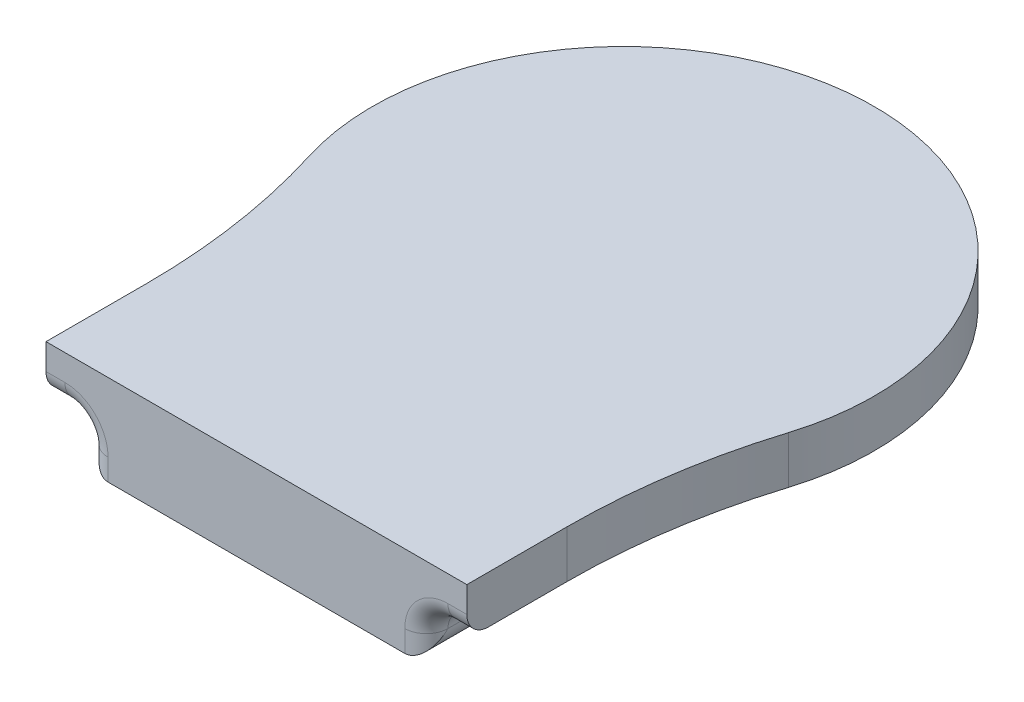
ISO-10303-21;
HEADER;
FILE_DESCRIPTION(('STEP AP214'),'2;1');
FILE_NAME('part.step','',(''),(''),'','','');
FILE_SCHEMA(('AUTOMOTIVE_DESIGN { 1 0 10303 214 1 1 1 1 }'));
ENDSEC;
DATA;
#1=APPLICATION_CONTEXT('core data for automotive mechanical design processes');
#2=APPLICATION_PROTOCOL_DEFINITION('international standard','automotive_design',2000,#1);
#3=PRODUCT_CONTEXT('',#1,'mechanical');
#4=PRODUCT('Part','Part','',(#3));
#5=PRODUCT_RELATED_PRODUCT_CATEGORY('part','',(#4));
#6=PRODUCT_DEFINITION_FORMATION('','',#4);
#7=PRODUCT_DEFINITION_CONTEXT('part definition',#1,'design');
#8=PRODUCT_DEFINITION('design','',#6,#7);
#9=PRODUCT_DEFINITION_SHAPE('','',#8);
#10=(LENGTH_UNIT() NAMED_UNIT(*) SI_UNIT(.MILLI.,.METRE.));
#11=(NAMED_UNIT(*) PLANE_ANGLE_UNIT() SI_UNIT($,.RADIAN.));
#12=(NAMED_UNIT(*) SI_UNIT($,.STERADIAN.) SOLID_ANGLE_UNIT());
#13=UNCERTAINTY_MEASURE_WITH_UNIT(LENGTH_MEASURE(1.E-05),#10,'distance_accuracy_value','');
#14=(GEOMETRIC_REPRESENTATION_CONTEXT(3) GLOBAL_UNCERTAINTY_ASSIGNED_CONTEXT((#13)) GLOBAL_UNIT_ASSIGNED_CONTEXT((#10,
#11,#12)) REPRESENTATION_CONTEXT('',''));
#15=CARTESIAN_POINT('',(0.,0.,0.));
#16=DIRECTION('',(0.,0.,1.));
#17=DIRECTION('',(1.,0.,0.));
#18=AXIS2_PLACEMENT_3D('',#15,#16,#17);
#19=CARTESIAN_POINT('',(39.75,11.3,12.3522518190004));
#20=DIRECTION('',(0.,1.,0.));
#21=DIRECTION('',(0.,0.,1.));
#22=AXIS2_PLACEMENT_3D('',#19,#20,#21);
#23=PLANE('',#22);
#24=DIRECTION('',(0.,0.,1.));
#25=VECTOR('',#24,1.);
#26=CARTESIAN_POINT('',(9.75,11.3,12.3522518190004));
#27=LINE('',#26,#25);
#28=CARTESIAN_POINT('',(9.75,11.3,12.3522518190004));
#29=VERTEX_POINT('',#28);
#30=CARTESIAN_POINT('',(9.75,11.3,16.));
#31=VERTEX_POINT('',#30);
#32=EDGE_CURVE('E276',#29,#31,#27,.T.);
#33=ORIENTED_EDGE('',*,*,#32,.T.);
#34=DIRECTION('',(-1.,0.,0.));
#35=VECTOR('',#34,1.);
#36=CARTESIAN_POINT('',(39.75,11.3,16.));
#37=LINE('',#36,#35);
#38=CARTESIAN_POINT('',(8.875,11.3,16.));
#39=VERTEX_POINT('',#38);
#40=EDGE_CURVE('E326',#31,#39,#37,.T.);
#41=ORIENTED_EDGE('',*,*,#40,.T.);
#42=DIRECTION('',(0.,0.,1.));
#43=VECTOR('',#42,1.);
#44=CARTESIAN_POINT('',(8.875,11.3,9.));
#45=LINE('',#44,#43);
#46=CARTESIAN_POINT('',(8.875,11.3,10.));
#47=VERTEX_POINT('',#46);
#48=EDGE_CURVE('E322',#39,#47,#45,.F.);
#49=ORIENTED_EDGE('',*,*,#48,.T.);
#50=CARTESIAN_POINT('',(6.875,11.3,10.));
#51=DIRECTION('',(0.,1.,0.));
#52=DIRECTION('',(0.,0.,1.));
#53=AXIS2_PLACEMENT_3D('',#50,#51,#52);
#54=CIRCLE('',#53,2.);
#55=CARTESIAN_POINT('',(6.875,11.3,8.));
#56=VERTEX_POINT('',#55);
#57=EDGE_CURVE('E319',#56,#47,#54,.F.);
#58=ORIENTED_EDGE('',*,*,#57,.F.);
#59=DIRECTION('',(1.,0.,0.));
#60=VECTOR('',#59,1.);
#61=CARTESIAN_POINT('',(-7.875,11.3,8.));
#62=LINE('',#61,#60);
#63=CARTESIAN_POINT('',(-6.875,11.3,8.));
#64=VERTEX_POINT('',#63);
#65=EDGE_CURVE('E315',#56,#64,#62,.F.);
#66=ORIENTED_EDGE('',*,*,#65,.T.);
#67=CARTESIAN_POINT('',(-6.875,11.3,10.));
#68=DIRECTION('',(0.,1.,0.));
#69=DIRECTION('',(0.,0.,1.));
#70=AXIS2_PLACEMENT_3D('',#67,#68,#69);
#71=CIRCLE('',#70,2.);
#72=CARTESIAN_POINT('',(-8.875,11.3,10.));
#73=VERTEX_POINT('',#72);
#74=EDGE_CURVE('E312',#73,#64,#71,.F.);
#75=ORIENTED_EDGE('',*,*,#74,.F.);
#76=DIRECTION('',(0.,0.,-1.));
#77=VECTOR('',#76,1.);
#78=CARTESIAN_POINT('',(-8.875,11.3,17.));
#79=LINE('',#78,#77);
#80=CARTESIAN_POINT('',(-8.875,11.3,16.));
#81=VERTEX_POINT('',#80);
#82=EDGE_CURVE('E317',#73,#81,#79,.F.);
#83=ORIENTED_EDGE('',*,*,#82,.T.);
#84=DIRECTION('',(-1.,0.,0.));
#85=VECTOR('',#84,1.);
#86=CARTESIAN_POINT('',(39.75,11.3,16.));
#87=LINE('',#86,#85);
#88=CARTESIAN_POINT('',(-9.75,11.3,16.));
#89=VERTEX_POINT('',#88);
#90=EDGE_CURVE('E324',#81,#89,#87,.T.);
#91=ORIENTED_EDGE('',*,*,#90,.T.);
#92=DIRECTION('',(0.,0.,-1.));
#93=VECTOR('',#92,1.);
#94=CARTESIAN_POINT('',(-9.75,11.3,12.3522518190004));
#95=LINE('',#94,#93);
#96=CARTESIAN_POINT('',(-9.75,11.3,12.3522518190004));
#97=VERTEX_POINT('',#96);
#98=EDGE_CURVE('E274',#89,#97,#95,.T.);
#99=ORIENTED_EDGE('',*,*,#98,.T.);
#100=CARTESIAN_POINT('',(-39.75,11.3,12.3522518190004));
#101=DIRECTION('',(0.,1.,0.));
#102=DIRECTION('',(0.,0.,1.));
#103=AXIS2_PLACEMENT_3D('',#100,#101,#102);
#104=CIRCLE('',#103,30.);
#105=CARTESIAN_POINT('',(-11.1013513513514,11.3,3.44972798548661));
#106=VERTEX_POINT('',#105);
#107=EDGE_CURVE('E271',#97,#106,#104,.T.);
#108=ORIENTED_EDGE('',*,*,#107,.T.);
#109=CARTESIAN_POINT('',(0.,11.3,0.));
#110=DIRECTION('',(0.,1.,0.));
#111=DIRECTION('',(0.,0.,1.));
#112=AXIS2_PLACEMENT_3D('',#109,#110,#111);
#113=CIRCLE('',#112,11.625);
#114=CARTESIAN_POINT('',(11.1013513513513,11.3,3.44972798548662));
#115=VERTEX_POINT('',#114);
#116=EDGE_CURVE('E267',#106,#115,#113,.F.);
#117=ORIENTED_EDGE('',*,*,#116,.T.);
#118=CARTESIAN_POINT('',(39.75,11.3,12.3522518190004));
#119=DIRECTION('',(0.,1.,0.));
#120=DIRECTION('',(0.,0.,1.));
#121=AXIS2_PLACEMENT_3D('',#118,#119,#120);
#122=CIRCLE('',#121,30.);
#123=EDGE_CURVE('E106',#115,#29,#122,.T.);
#124=ORIENTED_EDGE('',*,*,#123,.T.);
#125=EDGE_LOOP('',(#33,#41,#49,#58,#66,#75,#83,#91,#99,#108,#117,#124));
#126=FACE_BOUND('',#125,.T.);
#127=ADVANCED_FACE('F49',(#126),#23,.F.);
#128=CARTESIAN_POINT('',(9.75,11.3,0.));
#129=DIRECTION('',(1.,0.,0.));
#130=DIRECTION('',(0.,0.,-1.));
#131=AXIS2_PLACEMENT_3D('',#128,#129,#130);
#132=PLANE('',#131);
#133=DIRECTION('',(0.,-1.,0.));
#134=VECTOR('',#133,1.);
#135=CARTESIAN_POINT('',(9.75,11.3,17.));
#136=LINE('',#135,#134);
#137=CARTESIAN_POINT('',(9.75,13.5,17.));
#138=VERTEX_POINT('',#137);
#139=CARTESIAN_POINT('',(9.75,12.3,17.));
#140=VERTEX_POINT('',#139);
#141=EDGE_CURVE('E299',#138,#140,#136,.T.);
#142=ORIENTED_EDGE('',*,*,#141,.T.);
#143=CARTESIAN_POINT('',(9.75,12.3,16.));
#144=DIRECTION('',(1.,0.,0.));
#145=DIRECTION('',(0.,0.,-1.));
#146=AXIS2_PLACEMENT_3D('',#143,#144,#145);
#147=CIRCLE('',#146,1.);
#148=EDGE_CURVE('E213',#140,#31,#147,.T.);
#149=ORIENTED_EDGE('',*,*,#148,.T.);
#150=ORIENTED_EDGE('',*,*,#32,.F.);
#151=DIRECTION('',(0.,-1.,0.));
#152=VECTOR('',#151,1.);
#153=CARTESIAN_POINT('',(9.75,11.3,12.3522518190004));
#154=LINE('',#153,#152);
#155=CARTESIAN_POINT('',(9.75,13.5,12.3522518190004));
#156=VERTEX_POINT('',#155);
#157=EDGE_CURVE('E307',#29,#156,#154,.F.);
#158=ORIENTED_EDGE('',*,*,#157,.T.);
#159=DIRECTION('',(0.,0.,-1.));
#160=VECTOR('',#159,1.);
#161=CARTESIAN_POINT('',(9.75,13.5,12.3522518190004));
#162=LINE('',#161,#160);
#163=EDGE_CURVE('E293',#138,#156,#162,.T.);
#164=ORIENTED_EDGE('',*,*,#163,.F.);
#165=EDGE_LOOP('',(#142,#149,#150,#158,#164));
#166=FACE_BOUND('',#165,.T.);
#167=ADVANCED_FACE('F350',(#166),#132,.T.);
#168=CARTESIAN_POINT('',(0.,11.3,0.));
#169=DIRECTION('',(0.,-1.,0.));
#170=DIRECTION('',(0.,0.,-1.));
#171=AXIS2_PLACEMENT_3D('',#168,#169,#170);
#172=CYLINDRICAL_SURFACE('',#171,11.625);
#173=DIRECTION('',(0.,-1.,0.));
#174=VECTOR('',#173,1.);
#175=CARTESIAN_POINT('',(11.1013513513514,11.3,3.44972798548661));
#176=LINE('',#175,#174);
#177=CARTESIAN_POINT('',(11.1013513513514,13.5,3.44972798548661));
#178=VERTEX_POINT('',#177);
#179=EDGE_CURVE('E304',#178,#115,#176,.T.);
#180=ORIENTED_EDGE('',*,*,#179,.T.);
#181=ORIENTED_EDGE('',*,*,#116,.F.);
#182=DIRECTION('',(0.,-1.,0.));
#183=VECTOR('',#182,1.);
#184=CARTESIAN_POINT('',(-11.1013513513514,11.3,3.44972798548661));
#185=LINE('',#184,#183);
#186=CARTESIAN_POINT('',(-11.1013513513513,13.5,3.44972798548661));
#187=VERTEX_POINT('',#186);
#188=EDGE_CURVE('E302',#106,#187,#185,.F.);
#189=ORIENTED_EDGE('',*,*,#188,.T.);
#190=CARTESIAN_POINT('',(0.,13.5,0.));
#191=DIRECTION('',(0.,1.,0.));
#192=DIRECTION('',(0.,0.,1.));
#193=AXIS2_PLACEMENT_3D('',#190,#191,#192);
#194=CIRCLE('',#193,11.625);
#195=EDGE_CURVE('E281',#178,#187,#194,.T.);
#196=ORIENTED_EDGE('',*,*,#195,.F.);
#197=EDGE_LOOP('',(#180,#181,#189,#196));
#198=FACE_BOUND('',#197,.T.);
#199=ADVANCED_FACE('F356',(#198),#172,.T.);
#200=CARTESIAN_POINT('',(-9.75,11.3,0.));
#201=DIRECTION('',(1.,0.,0.));
#202=DIRECTION('',(0.,0.,-1.));
#203=AXIS2_PLACEMENT_3D('',#200,#201,#202);
#204=PLANE('',#203);
#205=ORIENTED_EDGE('',*,*,#98,.F.);
#206=CARTESIAN_POINT('',(-9.75,12.3,16.));
#207=DIRECTION('',(1.,0.,0.));
#208=DIRECTION('',(0.,0.,-1.));
#209=AXIS2_PLACEMENT_3D('',#206,#207,#208);
#210=CIRCLE('',#209,1.);
#211=CARTESIAN_POINT('',(-9.75,12.3,17.));
#212=VERTEX_POINT('',#211);
#213=EDGE_CURVE('E215',#89,#212,#210,.F.);
#214=ORIENTED_EDGE('',*,*,#213,.T.);
#215=DIRECTION('',(0.,-1.,0.));
#216=VECTOR('',#215,1.);
#217=CARTESIAN_POINT('',(-9.75,11.3,17.));
#218=LINE('',#217,#216);
#219=CARTESIAN_POINT('',(-9.75,13.5,17.));
#220=VERTEX_POINT('',#219);
#221=EDGE_CURVE('E296',#220,#212,#218,.T.);
#222=ORIENTED_EDGE('',*,*,#221,.F.);
#223=DIRECTION('',(0.,0.,1.));
#224=VECTOR('',#223,1.);
#225=CARTESIAN_POINT('',(-9.75,13.5,12.3522518190004));
#226=LINE('',#225,#224);
#227=CARTESIAN_POINT('',(-9.75,13.5,12.3522518190004));
#228=VERTEX_POINT('',#227);
#229=EDGE_CURVE('E287',#228,#220,#226,.T.);
#230=ORIENTED_EDGE('',*,*,#229,.F.);
#231=DIRECTION('',(0.,1.,0.));
#232=VECTOR('',#231,1.);
#233=CARTESIAN_POINT('',(-9.75,0.,12.3522518190004));
#234=LINE('',#233,#232);
#235=EDGE_CURVE('E309',#228,#97,#234,.F.);
#236=ORIENTED_EDGE('',*,*,#235,.T.);
#237=EDGE_LOOP('',(#205,#214,#222,#230,#236));
#238=FACE_BOUND('',#237,.T.);
#239=ADVANCED_FACE('F362',(#238),#204,.F.);
#240=CARTESIAN_POINT('',(0.,11.3,17.));
#241=DIRECTION('',(0.,0.,-1.));
#242=DIRECTION('',(-1.,0.,0.));
#243=AXIS2_PLACEMENT_3D('',#240,#241,#242);
#244=PLANE('',#243);
#245=CARTESIAN_POINT('',(8.875,10.3,17.));
#246=DIRECTION('',(0.,0.,-1.));
#247=DIRECTION('',(-1.,0.,0.));
#248=AXIS2_PLACEMENT_3D('',#245,#246,#247);
#249=CIRCLE('',#248,2.);
#250=CARTESIAN_POINT('',(8.875,12.3,17.));
#251=VERTEX_POINT('',#250);
#252=CARTESIAN_POINT('',(6.875,10.3,17.));
#253=VERTEX_POINT('',#252);
#254=EDGE_CURVE('E185',#251,#253,#249,.F.);
#255=ORIENTED_EDGE('',*,*,#254,.F.);
#256=DIRECTION('',(-1.,0.,0.));
#257=VECTOR('',#256,1.);
#258=CARTESIAN_POINT('',(0.,12.3,17.));
#259=LINE('',#258,#257);
#260=EDGE_CURVE('E192',#251,#140,#259,.F.);
#261=ORIENTED_EDGE('',*,*,#260,.T.);
#262=ORIENTED_EDGE('',*,*,#141,.F.);
#263=DIRECTION('',(1.,0.,0.));
#264=VECTOR('',#263,1.);
#265=CARTESIAN_POINT('',(-9.75,13.5,17.));
#266=LINE('',#265,#264);
#267=EDGE_CURVE('E290',#220,#138,#266,.T.);
#268=ORIENTED_EDGE('',*,*,#267,.F.);
#269=ORIENTED_EDGE('',*,*,#221,.T.);
#270=DIRECTION('',(-1.,0.,0.));
#271=VECTOR('',#270,1.);
#272=CARTESIAN_POINT('',(0.,12.3,17.));
#273=LINE('',#272,#271);
#274=CARTESIAN_POINT('',(-8.875,12.3,17.));
#275=VERTEX_POINT('',#274);
#276=EDGE_CURVE('E206',#212,#275,#273,.F.);
#277=ORIENTED_EDGE('',*,*,#276,.T.);
#278=CARTESIAN_POINT('',(-8.875,10.3,17.));
#279=DIRECTION('',(0.,0.,-1.));
#280=DIRECTION('',(-1.,0.,0.));
#281=AXIS2_PLACEMENT_3D('',#278,#279,#280);
#282=CIRCLE('',#281,2.);
#283=CARTESIAN_POINT('',(-6.875,10.3,17.));
#284=VERTEX_POINT('',#283);
#285=EDGE_CURVE('E208',#284,#275,#282,.F.);
#286=ORIENTED_EDGE('',*,*,#285,.F.);
#287=DIRECTION('',(0.,1.,0.));
#288=VECTOR('',#287,1.);
#289=CARTESIAN_POINT('',(-6.875,11.3,17.));
#290=LINE('',#289,#288);
#291=CARTESIAN_POINT('',(-6.875,9.3,17.));
#292=VERTEX_POINT('',#291);
#293=EDGE_CURVE('E329',#284,#292,#290,.F.);
#294=ORIENTED_EDGE('',*,*,#293,.T.);
#295=DIRECTION('',(-1.,0.,0.));
#296=VECTOR('',#295,1.);
#297=CARTESIAN_POINT('',(7.875,9.3,17.));
#298=LINE('',#297,#296);
#299=CARTESIAN_POINT('',(6.875,9.3,17.));
#300=VERTEX_POINT('',#299);
#301=EDGE_CURVE('E188',#300,#292,#298,.T.);
#302=ORIENTED_EDGE('',*,*,#301,.F.);
#303=DIRECTION('',(0.,1.,0.));
#304=VECTOR('',#303,1.);
#305=CARTESIAN_POINT('',(6.875,11.3,17.));
#306=LINE('',#305,#304);
#307=EDGE_CURVE('E181',#300,#253,#306,.T.);
#308=ORIENTED_EDGE('',*,*,#307,.T.);
#309=EDGE_LOOP('',(#255,#261,#262,#268,#269,#277,#286,#294,#302,#308));
#310=FACE_BOUND('',#309,.T.);
#311=ADVANCED_FACE('F183',(#310),#244,.F.);
#312=CARTESIAN_POINT('',(39.75,11.3,12.3522518190004));
#313=DIRECTION('',(0.,-1.,0.));
#314=DIRECTION('',(0.,0.,-1.));
#315=AXIS2_PLACEMENT_3D('',#312,#313,#314);
#316=CYLINDRICAL_SURFACE('',#315,30.);
#317=ORIENTED_EDGE('',*,*,#157,.F.);
#318=ORIENTED_EDGE('',*,*,#123,.F.);
#319=ORIENTED_EDGE('',*,*,#179,.F.);
#320=CARTESIAN_POINT('',(39.75,13.5,12.3522518190004));
#321=DIRECTION('',(0.,-1.,0.));
#322=DIRECTION('',(0.,0.,1.));
#323=AXIS2_PLACEMENT_3D('',#320,#321,#322);
#324=CIRCLE('',#323,30.);
#325=EDGE_CURVE('E273',#156,#178,#324,.T.);
#326=ORIENTED_EDGE('',*,*,#325,.F.);
#327=EDGE_LOOP('',(#317,#318,#319,#326));
#328=FACE_BOUND('',#327,.T.);
#329=ADVANCED_FACE('F361',(#328),#316,.F.);
#330=CARTESIAN_POINT('',(-39.75,11.3,12.3522518190004));
#331=DIRECTION('',(0.,-1.,0.));
#332=DIRECTION('',(0.,0.,-1.));
#333=AXIS2_PLACEMENT_3D('',#330,#331,#332);
#334=CYLINDRICAL_SURFACE('',#333,30.);
#335=ORIENTED_EDGE('',*,*,#188,.F.);
#336=ORIENTED_EDGE('',*,*,#107,.F.);
#337=ORIENTED_EDGE('',*,*,#235,.F.);
#338=CARTESIAN_POINT('',(-39.75,13.5,12.3522518190004));
#339=DIRECTION('',(0.,-1.,0.));
#340=DIRECTION('',(0.,0.,1.));
#341=AXIS2_PLACEMENT_3D('',#338,#339,#340);
#342=CIRCLE('',#341,30.);
#343=EDGE_CURVE('E284',#187,#228,#342,.T.);
#344=ORIENTED_EDGE('',*,*,#343,.F.);
#345=EDGE_LOOP('',(#335,#336,#337,#344));
#346=FACE_BOUND('',#345,.T.);
#347=ADVANCED_FACE('F346',(#346),#334,.F.);
#348=CARTESIAN_POINT('',(39.75,13.5,12.3522518190004));
#349=DIRECTION('',(0.,1.,0.));
#350=DIRECTION('',(0.,0.,1.));
#351=AXIS2_PLACEMENT_3D('',#348,#349,#350);
#352=PLANE('',#351);
#353=ORIENTED_EDGE('',*,*,#325,.T.);
#354=ORIENTED_EDGE('',*,*,#195,.T.);
#355=ORIENTED_EDGE('',*,*,#343,.T.);
#356=ORIENTED_EDGE('',*,*,#229,.T.);
#357=ORIENTED_EDGE('',*,*,#267,.T.);
#358=ORIENTED_EDGE('',*,*,#163,.T.);
#359=EDGE_LOOP('',(#353,#354,#355,#356,#357,#358));
#360=FACE_BOUND('',#359,.T.);
#361=ADVANCED_FACE('F338',(#360),#352,.T.);
#362=CARTESIAN_POINT('',(0.,9.3,0.));
#363=DIRECTION('',(0.,1.,0.));
#364=DIRECTION('',(0.,0.,1.));
#365=AXIS2_PLACEMENT_3D('',#362,#363,#364);
#366=PLANE('',#365);
#367=DIRECTION('',(1.,0.,0.));
#368=VECTOR('',#367,1.);
#369=CARTESIAN_POINT('',(0.,9.3,10.));
#370=LINE('',#369,#368);
#371=CARTESIAN_POINT('',(-6.875,9.3,10.));
#372=VERTEX_POINT('',#371);
#373=CARTESIAN_POINT('',(6.875,9.3,10.));
#374=VERTEX_POINT('',#373);
#375=EDGE_CURVE('E67',#372,#374,#370,.T.);
#376=ORIENTED_EDGE('',*,*,#375,.T.);
#377=DIRECTION('',(0.,0.,1.));
#378=VECTOR('',#377,1.);
#379=CARTESIAN_POINT('',(6.875,9.3,0.));
#380=LINE('',#379,#378);
#381=EDGE_CURVE('E13',#374,#300,#380,.T.);
#382=ORIENTED_EDGE('',*,*,#381,.T.);
#383=ORIENTED_EDGE('',*,*,#301,.T.);
#384=DIRECTION('',(0.,0.,-1.));
#385=VECTOR('',#384,1.);
#386=CARTESIAN_POINT('',(-6.875,9.3,0.));
#387=LINE('',#386,#385);
#388=EDGE_CURVE('E59',#292,#372,#387,.T.);
#389=ORIENTED_EDGE('',*,*,#388,.T.);
#390=EDGE_LOOP('',(#376,#382,#383,#389));
#391=FACE_BOUND('',#390,.T.);
#392=ADVANCED_FACE('F336',(#391),#366,.F.);
#393=CARTESIAN_POINT('',(39.75,12.3,16.));
#394=DIRECTION('',(-1.,0.,0.));
#395=DIRECTION('',(0.,0.,1.));
#396=AXIS2_PLACEMENT_3D('',#393,#394,#395);
#397=CYLINDRICAL_SURFACE('',#396,1.);
#398=ORIENTED_EDGE('',*,*,#213,.F.);
#399=ORIENTED_EDGE('',*,*,#90,.F.);
#400=CARTESIAN_POINT('',(-8.875,12.3,16.));
#401=DIRECTION('',(1.,0.,0.));
#402=DIRECTION('',(0.,0.,-1.));
#403=AXIS2_PLACEMENT_3D('',#400,#401,#402);
#404=CIRCLE('',#403,1.);
#405=EDGE_CURVE('E53',#275,#81,#404,.T.);
#406=ORIENTED_EDGE('',*,*,#405,.F.);
#407=ORIENTED_EDGE('',*,*,#276,.F.);
#408=EDGE_LOOP('',(#398,#399,#406,#407));
#409=FACE_BOUND('',#408,.T.);
#410=ADVANCED_FACE('F51',(#409),#397,.T.);
#411=CARTESIAN_POINT('',(-6.875,9.3,16.));
#412=DIRECTION('',(0.,1.,0.));
#413=DIRECTION('',(0.,0.,1.));
#414=AXIS2_PLACEMENT_3D('',#411,#412,#413);
#415=CYLINDRICAL_SURFACE('',#414,1.);
#416=CARTESIAN_POINT('',(-6.875,10.3,16.));
#417=DIRECTION('',(0.,-0.707106781186547,-0.707106781186547));
#418=DIRECTION('',(0.,0.707106781186547,-0.707106781186547));
#419=AXIS2_PLACEMENT_3D('',#416,#417,#418);
#420=ELLIPSE('',#419,1.41421356237309,1.);
#421=CARTESIAN_POINT('',(-7.875,10.3,16.));
#422=VERTEX_POINT('',#421);
#423=EDGE_CURVE('E261',#292,#422,#420,.T.);
#424=ORIENTED_EDGE('',*,*,#423,.F.);
#425=ORIENTED_EDGE('',*,*,#293,.F.);
#426=CARTESIAN_POINT('',(-6.875,10.3,16.));
#427=DIRECTION('',(0.,1.,0.));
#428=DIRECTION('',(0.,0.,1.));
#429=AXIS2_PLACEMENT_3D('',#426,#427,#428);
#430=CIRCLE('',#429,1.);
#431=EDGE_CURVE('E98',#422,#284,#430,.T.);
#432=ORIENTED_EDGE('',*,*,#431,.F.);
#433=EDGE_LOOP('',(#424,#425,#432));
#434=FACE_BOUND('',#433,.T.);
#435=ADVANCED_FACE('F332',(#434),#415,.T.);
#436=CARTESIAN_POINT('',(-8.875,10.3,16.));
#437=DIRECTION('',(0.,0.,-1.));
#438=DIRECTION('',(-1.,0.,0.));
#439=AXIS2_PLACEMENT_3D('',#436,#437,#438);
#440=TOROIDAL_SURFACE('',#439,2.,1.);
#441=ORIENTED_EDGE('',*,*,#285,.T.);
#442=ORIENTED_EDGE('',*,*,#405,.T.);
#443=CARTESIAN_POINT('',(-8.875,10.3,16.));
#444=DIRECTION('',(0.,0.,-1.));
#445=DIRECTION('',(-1.,0.,0.));
#446=AXIS2_PLACEMENT_3D('',#443,#444,#445);
#447=CIRCLE('',#446,1.);
#448=EDGE_CURVE('E258',#422,#81,#447,.F.);
#449=ORIENTED_EDGE('',*,*,#448,.F.);
#450=ORIENTED_EDGE('',*,*,#431,.T.);
#451=EDGE_LOOP('',(#441,#442,#449,#450));
#452=FACE_BOUND('',#451,.T.);
#453=ADVANCED_FACE('F330',(#452),#440,.T.);
#454=CARTESIAN_POINT('',(-6.875,10.3,0.));
#455=DIRECTION('',(0.,0.,-1.));
#456=DIRECTION('',(-1.,0.,0.));
#457=AXIS2_PLACEMENT_3D('',#454,#455,#456);
#458=CYLINDRICAL_SURFACE('',#457,1.);
#459=ORIENTED_EDGE('',*,*,#388,.F.);
#460=ORIENTED_EDGE('',*,*,#423,.T.);
#461=DIRECTION('',(0.,0.,-1.));
#462=VECTOR('',#461,1.);
#463=CARTESIAN_POINT('',(-7.875,10.3,17.));
#464=LINE('',#463,#462);
#465=CARTESIAN_POINT('',(-7.875,10.3,10.));
#466=VERTEX_POINT('',#465);
#467=EDGE_CURVE('E90',#466,#422,#464,.F.);
#468=ORIENTED_EDGE('',*,*,#467,.F.);
#469=CARTESIAN_POINT('',(-6.875,10.3,10.));
#470=DIRECTION('',(0.,0.,-1.));
#471=DIRECTION('',(-1.,0.,0.));
#472=AXIS2_PLACEMENT_3D('',#469,#470,#471);
#473=CIRCLE('',#472,1.);
#474=EDGE_CURVE('E254',#372,#466,#473,.T.);
#475=ORIENTED_EDGE('',*,*,#474,.F.);
#476=EDGE_LOOP('',(#459,#460,#468,#475));
#477=FACE_BOUND('',#476,.T.);
#478=ADVANCED_FACE('F334',(#477),#458,.T.);
#479=CARTESIAN_POINT('',(-8.875,10.3,17.));
#480=DIRECTION('',(0.,0.,1.));
#481=DIRECTION('',(1.,0.,0.));
#482=AXIS2_PLACEMENT_3D('',#479,#480,#481);
#483=CYLINDRICAL_SURFACE('',#482,1.);
#484=CARTESIAN_POINT('',(-8.875,10.3,10.));
#485=DIRECTION('',(0.,0.,1.));
#486=DIRECTION('',(1.,0.,0.));
#487=AXIS2_PLACEMENT_3D('',#484,#485,#486);
#488=CIRCLE('',#487,1.);
#489=EDGE_CURVE('E251',#466,#73,#488,.T.);
#490=ORIENTED_EDGE('',*,*,#489,.F.);
#491=ORIENTED_EDGE('',*,*,#467,.T.);
#492=ORIENTED_EDGE('',*,*,#448,.T.);
#493=ORIENTED_EDGE('',*,*,#82,.F.);
#494=EDGE_LOOP('',(#490,#491,#492,#493));
#495=FACE_BOUND('',#494,.T.);
#496=ADVANCED_FACE('F414',(#495),#483,.F.);
#497=CARTESIAN_POINT('',(-6.875,10.3,10.));
#498=DIRECTION('',(0.,0.,1.));
#499=DIRECTION('',(1.,0.,0.));
#500=AXIS2_PLACEMENT_3D('',#497,#498,#499);
#501=SPHERICAL_SURFACE('',#500,1.);
#502=ORIENTED_EDGE('',*,*,#474,.T.);
#503=CARTESIAN_POINT('',(-6.875,10.3,10.));
#504=DIRECTION('',(0.,1.,0.));
#505=DIRECTION('',(0.,0.,1.));
#506=AXIS2_PLACEMENT_3D('',#503,#504,#505);
#507=CIRCLE('',#506,1.);
#508=CARTESIAN_POINT('',(-6.875,10.3,9.));
#509=VERTEX_POINT('',#508);
#510=EDGE_CURVE('E249',#509,#466,#507,.T.);
#511=ORIENTED_EDGE('',*,*,#510,.F.);
#512=CARTESIAN_POINT('',(-6.875,10.3,10.));
#513=DIRECTION('',(-1.,0.,0.));
#514=DIRECTION('',(0.,-1.,0.));
#515=AXIS2_PLACEMENT_3D('',#512,#513,#514);
#516=CIRCLE('',#515,1.);
#517=EDGE_CURVE('E246',#372,#509,#516,.F.);
#518=ORIENTED_EDGE('',*,*,#517,.F.);
#519=EDGE_LOOP('',(#502,#511,#518));
#520=FACE_BOUND('',#519,.T.);
#521=ADVANCED_FACE('F410',(#520),#501,.T.);
#522=CARTESIAN_POINT('',(-6.875,10.3,10.));
#523=DIRECTION('',(0.,1.,0.));
#524=DIRECTION('',(0.,0.,1.));
#525=AXIS2_PLACEMENT_3D('',#522,#523,#524);
#526=TOROIDAL_SURFACE('',#525,2.,1.);
#527=ORIENTED_EDGE('',*,*,#489,.T.);
#528=ORIENTED_EDGE('',*,*,#74,.T.);
#529=CARTESIAN_POINT('',(-6.875,10.3,8.));
#530=DIRECTION('',(1.,0.,0.));
#531=DIRECTION('',(0.,0.,-1.));
#532=AXIS2_PLACEMENT_3D('',#529,#530,#531);
#533=CIRCLE('',#532,1.);
#534=EDGE_CURVE('E243',#509,#64,#533,.F.);
#535=ORIENTED_EDGE('',*,*,#534,.F.);
#536=ORIENTED_EDGE('',*,*,#510,.T.);
#537=EDGE_LOOP('',(#527,#528,#535,#536));
#538=FACE_BOUND('',#537,.T.);
#539=ADVANCED_FACE('F406',(#538),#526,.F.);
#540=CARTESIAN_POINT('',(0.,10.3,10.));
#541=DIRECTION('',(1.,0.,0.));
#542=DIRECTION('',(0.,0.,-1.));
#543=AXIS2_PLACEMENT_3D('',#540,#541,#542);
#544=CYLINDRICAL_SURFACE('',#543,1.);
#545=ORIENTED_EDGE('',*,*,#375,.F.);
#546=ORIENTED_EDGE('',*,*,#517,.T.);
#547=DIRECTION('',(1.,0.,0.));
#548=VECTOR('',#547,1.);
#549=CARTESIAN_POINT('',(7.875,10.3,9.));
#550=LINE('',#549,#548);
#551=CARTESIAN_POINT('',(6.875,10.3,9.));
#552=VERTEX_POINT('',#551);
#553=EDGE_CURVE('E240',#552,#509,#550,.F.);
#554=ORIENTED_EDGE('',*,*,#553,.F.);
#555=CARTESIAN_POINT('',(6.875,10.3,10.));
#556=DIRECTION('',(1.,0.,0.));
#557=DIRECTION('',(0.,0.,-1.));
#558=AXIS2_PLACEMENT_3D('',#555,#556,#557);
#559=CIRCLE('',#558,1.);
#560=EDGE_CURVE('E237',#374,#552,#559,.T.);
#561=ORIENTED_EDGE('',*,*,#560,.F.);
#562=EDGE_LOOP('',(#545,#546,#554,#561));
#563=FACE_BOUND('',#562,.T.);
#564=ADVANCED_FACE('F402',(#563),#544,.T.);
#565=CARTESIAN_POINT('',(7.875,10.3,8.));
#566=DIRECTION('',(-1.,0.,0.));
#567=DIRECTION('',(0.,0.,1.));
#568=AXIS2_PLACEMENT_3D('',#565,#566,#567);
#569=CYLINDRICAL_SURFACE('',#568,1.);
#570=CARTESIAN_POINT('',(6.875,10.3,8.));
#571=DIRECTION('',(-1.,0.,0.));
#572=DIRECTION('',(0.,0.,1.));
#573=AXIS2_PLACEMENT_3D('',#570,#571,#572);
#574=CIRCLE('',#573,1.);
#575=EDGE_CURVE('E234',#552,#56,#574,.T.);
#576=ORIENTED_EDGE('',*,*,#575,.F.);
#577=ORIENTED_EDGE('',*,*,#553,.T.);
#578=ORIENTED_EDGE('',*,*,#534,.T.);
#579=ORIENTED_EDGE('',*,*,#65,.F.);
#580=EDGE_LOOP('',(#576,#577,#578,#579));
#581=FACE_BOUND('',#580,.T.);
#582=ADVANCED_FACE('F398',(#581),#569,.F.);
#583=CARTESIAN_POINT('',(6.875,10.3,10.));
#584=DIRECTION('',(0.,0.,1.));
#585=DIRECTION('',(1.,0.,0.));
#586=AXIS2_PLACEMENT_3D('',#583,#584,#585);
#587=SPHERICAL_SURFACE('',#586,1.);
#588=ORIENTED_EDGE('',*,*,#560,.T.);
#589=CARTESIAN_POINT('',(6.875,10.3,10.));
#590=DIRECTION('',(0.,1.,0.));
#591=DIRECTION('',(0.,0.,1.));
#592=AXIS2_PLACEMENT_3D('',#589,#590,#591);
#593=CIRCLE('',#592,1.);
#594=CARTESIAN_POINT('',(7.875,10.3,10.));
#595=VERTEX_POINT('',#594);
#596=EDGE_CURVE('E231',#595,#552,#593,.T.);
#597=ORIENTED_EDGE('',*,*,#596,.F.);
#598=CARTESIAN_POINT('',(6.875,10.3,10.));
#599=DIRECTION('',(0.,0.,-1.));
#600=DIRECTION('',(-1.,0.,0.));
#601=AXIS2_PLACEMENT_3D('',#598,#599,#600);
#602=CIRCLE('',#601,1.);
#603=EDGE_CURVE('E228',#374,#595,#602,.F.);
#604=ORIENTED_EDGE('',*,*,#603,.F.);
#605=EDGE_LOOP('',(#588,#597,#604));
#606=FACE_BOUND('',#605,.T.);
#607=ADVANCED_FACE('F394',(#606),#587,.T.);
#608=CARTESIAN_POINT('',(6.875,10.3,10.));
#609=DIRECTION('',(0.,1.,0.));
#610=DIRECTION('',(0.,0.,1.));
#611=AXIS2_PLACEMENT_3D('',#608,#609,#610);
#612=TOROIDAL_SURFACE('',#611,2.,1.);
#613=ORIENTED_EDGE('',*,*,#575,.T.);
#614=ORIENTED_EDGE('',*,*,#57,.T.);
#615=CARTESIAN_POINT('',(8.875,10.3,10.));
#616=DIRECTION('',(0.,0.,1.));
#617=DIRECTION('',(1.,0.,0.));
#618=AXIS2_PLACEMENT_3D('',#615,#616,#617);
#619=CIRCLE('',#618,1.);
#620=EDGE_CURVE('E225',#595,#47,#619,.F.);
#621=ORIENTED_EDGE('',*,*,#620,.F.);
#622=ORIENTED_EDGE('',*,*,#596,.T.);
#623=EDGE_LOOP('',(#613,#614,#621,#622));
#624=FACE_BOUND('',#623,.T.);
#625=ADVANCED_FACE('F390',(#624),#612,.F.);
#626=CARTESIAN_POINT('',(6.875,10.3,0.));
#627=DIRECTION('',(0.,0.,1.));
#628=DIRECTION('',(1.,0.,0.));
#629=AXIS2_PLACEMENT_3D('',#626,#627,#628);
#630=CYLINDRICAL_SURFACE('',#629,1.);
#631=ORIENTED_EDGE('',*,*,#381,.F.);
#632=ORIENTED_EDGE('',*,*,#603,.T.);
#633=DIRECTION('',(0.,0.,1.));
#634=VECTOR('',#633,1.);
#635=CARTESIAN_POINT('',(7.875,10.3,17.));
#636=LINE('',#635,#634);
#637=CARTESIAN_POINT('',(7.875,10.3,16.));
#638=VERTEX_POINT('',#637);
#639=EDGE_CURVE('E222',#638,#595,#636,.F.);
#640=ORIENTED_EDGE('',*,*,#639,.F.);
#641=CARTESIAN_POINT('',(6.875,10.3,16.));
#642=DIRECTION('',(0.,0.707106781186547,0.707106781186547));
#643=DIRECTION('',(0.,0.707106781186547,-0.707106781186547));
#644=AXIS2_PLACEMENT_3D('',#641,#642,#643);
#645=ELLIPSE('',#644,1.41421356237309,1.);
#646=EDGE_CURVE('E197',#300,#638,#645,.T.);
#647=ORIENTED_EDGE('',*,*,#646,.F.);
#648=EDGE_LOOP('',(#631,#632,#640,#647));
#649=FACE_BOUND('',#648,.T.);
#650=ADVANCED_FACE('F386',(#649),#630,.T.);
#651=CARTESIAN_POINT('',(8.875,10.3,17.));
#652=DIRECTION('',(0.,0.,-1.));
#653=DIRECTION('',(-1.,0.,0.));
#654=AXIS2_PLACEMENT_3D('',#651,#652,#653);
#655=CYLINDRICAL_SURFACE('',#654,1.);
#656=ORIENTED_EDGE('',*,*,#620,.T.);
#657=ORIENTED_EDGE('',*,*,#48,.F.);
#658=CARTESIAN_POINT('',(8.875,10.3,16.));
#659=DIRECTION('',(0.,0.,-1.));
#660=DIRECTION('',(-1.,0.,0.));
#661=AXIS2_PLACEMENT_3D('',#658,#659,#660);
#662=CIRCLE('',#661,1.);
#663=EDGE_CURVE('E201',#638,#39,#662,.T.);
#664=ORIENTED_EDGE('',*,*,#663,.F.);
#665=ORIENTED_EDGE('',*,*,#639,.T.);
#666=EDGE_LOOP('',(#656,#657,#664,#665));
#667=FACE_BOUND('',#666,.T.);
#668=ADVANCED_FACE('F383',(#667),#655,.F.);
#669=CARTESIAN_POINT('',(6.875,11.3,16.));
#670=DIRECTION('',(0.,1.,0.));
#671=DIRECTION('',(0.,0.,1.));
#672=AXIS2_PLACEMENT_3D('',#669,#670,#671);
#673=CYLINDRICAL_SURFACE('',#672,1.);
#674=ORIENTED_EDGE('',*,*,#307,.F.);
#675=ORIENTED_EDGE('',*,*,#646,.T.);
#676=CARTESIAN_POINT('',(6.875,10.3,16.));
#677=DIRECTION('',(0.,1.,0.));
#678=DIRECTION('',(0.,0.,1.));
#679=AXIS2_PLACEMENT_3D('',#676,#677,#678);
#680=CIRCLE('',#679,1.);
#681=EDGE_CURVE('E195',#253,#638,#680,.T.);
#682=ORIENTED_EDGE('',*,*,#681,.F.);
#683=EDGE_LOOP('',(#674,#675,#682));
#684=FACE_BOUND('',#683,.T.);
#685=ADVANCED_FACE('F196',(#684),#673,.T.);
#686=CARTESIAN_POINT('',(8.875,10.3,16.));
#687=DIRECTION('',(0.,0.,-1.));
#688=DIRECTION('',(-1.,0.,0.));
#689=AXIS2_PLACEMENT_3D('',#686,#687,#688);
#690=TOROIDAL_SURFACE('',#689,2.,1.);
#691=ORIENTED_EDGE('',*,*,#681,.T.);
#692=ORIENTED_EDGE('',*,*,#663,.T.);
#693=CARTESIAN_POINT('',(8.875,12.3,16.));
#694=DIRECTION('',(-1.,0.,0.));
#695=DIRECTION('',(0.,0.,1.));
#696=AXIS2_PLACEMENT_3D('',#693,#694,#695);
#697=CIRCLE('',#696,1.);
#698=EDGE_CURVE('E202',#251,#39,#697,.F.);
#699=ORIENTED_EDGE('',*,*,#698,.F.);
#700=ORIENTED_EDGE('',*,*,#254,.T.);
#701=EDGE_LOOP('',(#691,#692,#699,#700));
#702=FACE_BOUND('',#701,.T.);
#703=ADVANCED_FACE('F205',(#702),#690,.T.);
#704=CARTESIAN_POINT('',(39.75,12.3,16.));
#705=DIRECTION('',(-1.,0.,0.));
#706=DIRECTION('',(0.,0.,1.));
#707=AXIS2_PLACEMENT_3D('',#704,#705,#706);
#708=CYLINDRICAL_SURFACE('',#707,1.);
#709=ORIENTED_EDGE('',*,*,#148,.F.);
#710=ORIENTED_EDGE('',*,*,#260,.F.);
#711=ORIENTED_EDGE('',*,*,#698,.T.);
#712=ORIENTED_EDGE('',*,*,#40,.F.);
#713=EDGE_LOOP('',(#709,#710,#711,#712));
#714=FACE_BOUND('',#713,.T.);
#715=ADVANCED_FACE('F375',(#714),#708,.T.);
#716=CLOSED_SHELL('',(#127,#167,#199,#239,#311,#329,#347,#361,#392,#410,#435,#453,#478,#496,
#521,#539,#564,#582,#607,#625,#650,#668,#685,#703,#715));
#717=MANIFOLD_SOLID_BREP('B2',#716);
#718=ADVANCED_BREP_SHAPE_REPRESENTATION('',(#18,#717),#14);
#719=SHAPE_DEFINITION_REPRESENTATION(#9,#718);
ENDSEC;
END-ISO-10303-21;
